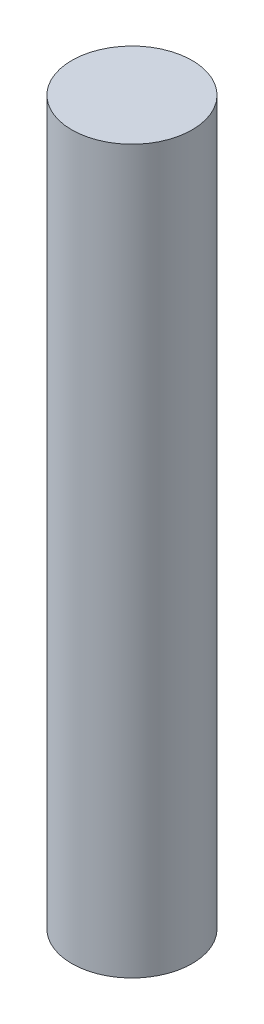
ISO-10303-21;
HEADER;
FILE_DESCRIPTION(('STEP AP214'),'2;1');
FILE_NAME('part.step','',(''),(''),'','','');
FILE_SCHEMA(('AUTOMOTIVE_DESIGN { 1 0 10303 214 1 1 1 1 }'));
ENDSEC;
DATA;
#1=APPLICATION_CONTEXT('core data for automotive mechanical design processes');
#2=APPLICATION_PROTOCOL_DEFINITION('international standard','automotive_design',2000,#1);
#3=PRODUCT_CONTEXT('',#1,'mechanical');
#4=PRODUCT('Part','Part','',(#3));
#5=PRODUCT_RELATED_PRODUCT_CATEGORY('part','',(#4));
#6=PRODUCT_DEFINITION_FORMATION('','',#4);
#7=PRODUCT_DEFINITION_CONTEXT('part definition',#1,'design');
#8=PRODUCT_DEFINITION('design','',#6,#7);
#9=PRODUCT_DEFINITION_SHAPE('','',#8);
#10=(LENGTH_UNIT() NAMED_UNIT(*) SI_UNIT(.MILLI.,.METRE.));
#11=(NAMED_UNIT(*) PLANE_ANGLE_UNIT() SI_UNIT($,.RADIAN.));
#12=(NAMED_UNIT(*) SI_UNIT($,.STERADIAN.) SOLID_ANGLE_UNIT());
#13=UNCERTAINTY_MEASURE_WITH_UNIT(LENGTH_MEASURE(1.E-05),#10,'distance_accuracy_value','');
#14=(GEOMETRIC_REPRESENTATION_CONTEXT(3) GLOBAL_UNCERTAINTY_ASSIGNED_CONTEXT((#13)) GLOBAL_UNIT_ASSIGNED_CONTEXT((#10,
#11,#12)) REPRESENTATION_CONTEXT('',''));
#15=CARTESIAN_POINT('',(0.,0.,0.));
#16=DIRECTION('',(0.,0.,1.));
#17=DIRECTION('',(1.,0.,0.));
#18=AXIS2_PLACEMENT_3D('',#15,#16,#17);
#19=CARTESIAN_POINT('',(-2.,-23.,-19.5));
#20=DIRECTION('',(0.,-1.,0.));
#21=DIRECTION('',(0.,0.,-1.));
#22=AXIS2_PLACEMENT_3D('',#19,#20,#21);
#23=CYLINDRICAL_SURFACE('',#22,1.);
#24=CARTESIAN_POINT('',(-2.,-23.,-19.5));
#25=DIRECTION('',(0.,1.,0.));
#26=DIRECTION('',(0.,0.,1.));
#27=AXIS2_PLACEMENT_3D('',#24,#25,#26);
#28=CIRCLE('',#27,1.);
#29=CARTESIAN_POINT('',(-2.,-23.,-18.5));
#30=VERTEX_POINT('',#29);
#31=EDGE_CURVE('E10',#30,#30,#28,.T.);
#32=ORIENTED_EDGE('',*,*,#31,.F.);
#33=EDGE_LOOP('',(#32));
#34=FACE_BOUND('',#33,.T.);
#35=CARTESIAN_POINT('',(-2.,-35.,-19.5));
#36=DIRECTION('',(0.,1.,0.));
#37=DIRECTION('',(0.,0.,1.));
#38=AXIS2_PLACEMENT_3D('',#35,#36,#37);
#39=CIRCLE('',#38,1.);
#40=CARTESIAN_POINT('',(-2.,-35.,-18.5));
#41=VERTEX_POINT('',#40);
#42=EDGE_CURVE('E45',#41,#41,#39,.T.);
#43=ORIENTED_EDGE('',*,*,#42,.T.);
#44=EDGE_LOOP('',(#43));
#45=FACE_BOUND('',#44,.T.);
#46=ADVANCED_FACE('F39',(#34,#45),#23,.T.);
#47=CARTESIAN_POINT('',(-2.,-23.,-19.5));
#48=DIRECTION('',(0.,1.,0.));
#49=DIRECTION('',(0.,0.,1.));
#50=AXIS2_PLACEMENT_3D('',#47,#48,#49);
#51=PLANE('',#50);
#52=ORIENTED_EDGE('',*,*,#31,.T.);
#53=EDGE_LOOP('',(#52));
#54=FACE_BOUND('',#53,.T.);
#55=ADVANCED_FACE('F53',(#54),#51,.T.);
#56=CARTESIAN_POINT('',(-2.,-35.,-19.5));
#57=DIRECTION('',(0.,1.,0.));
#58=DIRECTION('',(0.,0.,1.));
#59=AXIS2_PLACEMENT_3D('',#56,#57,#58);
#60=PLANE('',#59);
#61=ORIENTED_EDGE('',*,*,#42,.F.);
#62=EDGE_LOOP('',(#61));
#63=FACE_BOUND('',#62,.T.);
#64=ADVANCED_FACE('F55',(#63),#60,.F.);
#65=CLOSED_SHELL('',(#46,#55,#64));
#66=MANIFOLD_SOLID_BREP('B2',#65);
#67=ADVANCED_BREP_SHAPE_REPRESENTATION('',(#18,#66),#14);
#68=SHAPE_DEFINITION_REPRESENTATION(#9,#67);
ENDSEC;
END-ISO-10303-21;
